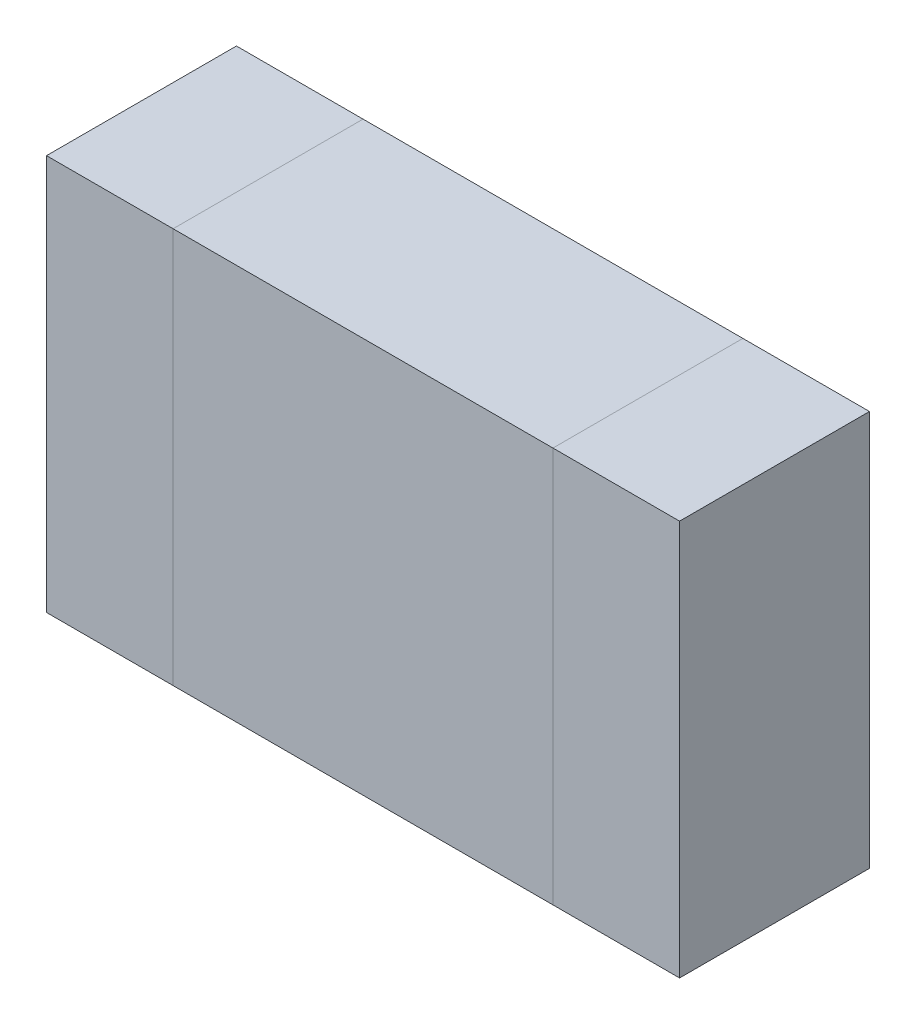
ISO-10303-21;
HEADER;
FILE_DESCRIPTION(('STEP AP214'),'2;1');
FILE_NAME('part.step','',(''),(''),'','','');
FILE_SCHEMA(('AUTOMOTIVE_DESIGN { 1 0 10303 214 1 1 1 1 }'));
ENDSEC;
DATA;
#1=APPLICATION_CONTEXT('core data for automotive mechanical design processes');
#2=APPLICATION_PROTOCOL_DEFINITION('international standard','automotive_design',2000,#1);
#3=PRODUCT_CONTEXT('',#1,'mechanical');
#4=PRODUCT('Part','Part','',(#3));
#5=PRODUCT_RELATED_PRODUCT_CATEGORY('part','',(#4));
#6=PRODUCT_DEFINITION_FORMATION('','',#4);
#7=PRODUCT_DEFINITION_CONTEXT('part definition',#1,'design');
#8=PRODUCT_DEFINITION('design','',#6,#7);
#9=PRODUCT_DEFINITION_SHAPE('','',#8);
#10=(LENGTH_UNIT() NAMED_UNIT(*) SI_UNIT(.MILLI.,.METRE.));
#11=(NAMED_UNIT(*) PLANE_ANGLE_UNIT() SI_UNIT($,.RADIAN.));
#12=(NAMED_UNIT(*) SI_UNIT($,.STERADIAN.) SOLID_ANGLE_UNIT());
#13=UNCERTAINTY_MEASURE_WITH_UNIT(LENGTH_MEASURE(1.E-05),#10,'distance_accuracy_value','');
#14=(GEOMETRIC_REPRESENTATION_CONTEXT(3) GLOBAL_UNCERTAINTY_ASSIGNED_CONTEXT((#13)) GLOBAL_UNIT_ASSIGNED_CONTEXT((#10,
#11,#12)) REPRESENTATION_CONTEXT('',''));
#15=CARTESIAN_POINT('',(0.,0.,0.));
#16=DIRECTION('',(0.,0.,1.));
#17=DIRECTION('',(1.,0.,0.));
#18=AXIS2_PLACEMENT_3D('',#15,#16,#17);
#19=CARTESIAN_POINT('',(1.,0.625,0.6));
#20=DIRECTION('',(0.,-1.,0.));
#21=DIRECTION('',(0.,0.,-1.));
#22=AXIS2_PLACEMENT_3D('',#19,#20,#21);
#23=PLANE('',#22);
#24=DIRECTION('',(0.,0.,1.));
#25=VECTOR('',#24,1.);
#26=CARTESIAN_POINT('',(-0.6,0.625,0.6));
#27=LINE('',#26,#25);
#28=CARTESIAN_POINT('',(-0.6,0.625,0.));
#29=VERTEX_POINT('',#28);
#30=CARTESIAN_POINT('',(-0.6,0.625,0.6));
#31=VERTEX_POINT('',#30);
#32=EDGE_CURVE('E11',#29,#31,#27,.T.);
#33=ORIENTED_EDGE('',*,*,#32,.F.);
#34=DIRECTION('',(-1.,0.,0.));
#35=VECTOR('',#34,1.);
#36=CARTESIAN_POINT('',(1.,0.625,0.));
#37=LINE('',#36,#35);
#38=CARTESIAN_POINT('',(-1.,0.625,0.));
#39=VERTEX_POINT('',#38);
#40=EDGE_CURVE('E23',#29,#39,#37,.T.);
#41=ORIENTED_EDGE('',*,*,#40,.T.);
#42=DIRECTION('',(0.,0.,-1.));
#43=VECTOR('',#42,1.);
#44=CARTESIAN_POINT('',(-1.,0.625,0.6));
#45=LINE('',#44,#43);
#46=CARTESIAN_POINT('',(-1.,0.625,0.6));
#47=VERTEX_POINT('',#46);
#48=EDGE_CURVE('E151',#47,#39,#45,.T.);
#49=ORIENTED_EDGE('',*,*,#48,.F.);
#50=DIRECTION('',(-1.,0.,0.));
#51=VECTOR('',#50,1.);
#52=CARTESIAN_POINT('',(1.,0.625,0.6));
#53=LINE('',#52,#51);
#54=EDGE_CURVE('E148',#31,#47,#53,.T.);
#55=ORIENTED_EDGE('',*,*,#54,.F.);
#56=EDGE_LOOP('',(#33,#41,#49,#55));
#57=FACE_BOUND('',#56,.T.);
#58=ADVANCED_FACE('F16',(#57),#23,.F.);
#59=CARTESIAN_POINT('',(1.,0.625,0.6));
#60=DIRECTION('',(0.,-1.,0.));
#61=DIRECTION('',(0.,0.,-1.));
#62=AXIS2_PLACEMENT_3D('',#59,#60,#61);
#63=PLANE('',#62);
#64=DIRECTION('',(0.,0.,-1.));
#65=VECTOR('',#64,1.);
#66=CARTESIAN_POINT('',(0.6,0.625,0.6));
#67=LINE('',#66,#65);
#68=CARTESIAN_POINT('',(0.6,0.625,0.6));
#69=VERTEX_POINT('',#68);
#70=CARTESIAN_POINT('',(0.6,0.625,0.));
#71=VERTEX_POINT('',#70);
#72=EDGE_CURVE('E146',#69,#71,#67,.T.);
#73=ORIENTED_EDGE('',*,*,#72,.F.);
#74=DIRECTION('',(-1.,0.,0.));
#75=VECTOR('',#74,1.);
#76=CARTESIAN_POINT('',(1.,0.625,0.6));
#77=LINE('',#76,#75);
#78=CARTESIAN_POINT('',(1.,0.625,0.6));
#79=VERTEX_POINT('',#78);
#80=EDGE_CURVE('E144',#79,#69,#77,.T.);
#81=ORIENTED_EDGE('',*,*,#80,.F.);
#82=DIRECTION('',(0.,0.,-1.));
#83=VECTOR('',#82,1.);
#84=CARTESIAN_POINT('',(1.,0.625,0.6));
#85=LINE('',#84,#83);
#86=CARTESIAN_POINT('',(1.,0.625,0.));
#87=VERTEX_POINT('',#86);
#88=EDGE_CURVE('E103',#79,#87,#85,.T.);
#89=ORIENTED_EDGE('',*,*,#88,.T.);
#90=DIRECTION('',(-1.,0.,0.));
#91=VECTOR('',#90,1.);
#92=CARTESIAN_POINT('',(1.,0.625,0.));
#93=LINE('',#92,#91);
#94=EDGE_CURVE('E140',#87,#71,#93,.T.);
#95=ORIENTED_EDGE('',*,*,#94,.T.);
#96=EDGE_LOOP('',(#73,#81,#89,#95));
#97=FACE_BOUND('',#96,.T.);
#98=ADVANCED_FACE('F182',(#97),#63,.F.);
#99=CARTESIAN_POINT('',(0.,0.,0.));
#100=DIRECTION('',(0.,0.,1.));
#101=DIRECTION('',(1.,0.,0.));
#102=AXIS2_PLACEMENT_3D('',#99,#100,#101);
#103=PLANE('',#102);
#104=DIRECTION('',(0.,1.,0.));
#105=VECTOR('',#104,1.);
#106=CARTESIAN_POINT('',(-0.6,0.,0.));
#107=LINE('',#106,#105);
#108=CARTESIAN_POINT('',(-0.6,-0.625,0.));
#109=VERTEX_POINT('',#108);
#110=EDGE_CURVE('E137',#109,#29,#107,.T.);
#111=ORIENTED_EDGE('',*,*,#110,.F.);
#112=DIRECTION('',(1.,0.,0.));
#113=VECTOR('',#112,1.);
#114=CARTESIAN_POINT('',(-1.,-0.625,0.));
#115=LINE('',#114,#113);
#116=CARTESIAN_POINT('',(-1.,-0.625,0.));
#117=VERTEX_POINT('',#116);
#118=EDGE_CURVE('E134',#117,#109,#115,.T.);
#119=ORIENTED_EDGE('',*,*,#118,.F.);
#120=DIRECTION('',(0.,-1.,0.));
#121=VECTOR('',#120,1.);
#122=CARTESIAN_POINT('',(-1.,0.625,0.));
#123=LINE('',#122,#121);
#124=EDGE_CURVE('E131',#39,#117,#123,.T.);
#125=ORIENTED_EDGE('',*,*,#124,.F.);
#126=ORIENTED_EDGE('',*,*,#40,.F.);
#127=EDGE_LOOP('',(#111,#119,#125,#126));
#128=FACE_BOUND('',#127,.T.);
#129=ADVANCED_FACE('F159',(#128),#103,.F.);
#130=CARTESIAN_POINT('',(0.,0.,0.));
#131=DIRECTION('',(0.,0.,1.));
#132=DIRECTION('',(1.,0.,0.));
#133=AXIS2_PLACEMENT_3D('',#130,#131,#132);
#134=PLANE('',#133);
#135=DIRECTION('',(0.,-1.,0.));
#136=VECTOR('',#135,1.);
#137=CARTESIAN_POINT('',(0.6,0.,0.));
#138=LINE('',#137,#136);
#139=CARTESIAN_POINT('',(0.6,-0.625,0.));
#140=VERTEX_POINT('',#139);
#141=EDGE_CURVE('E129',#71,#140,#138,.T.);
#142=ORIENTED_EDGE('',*,*,#141,.F.);
#143=ORIENTED_EDGE('',*,*,#94,.F.);
#144=DIRECTION('',(0.,1.,0.));
#145=VECTOR('',#144,1.);
#146=CARTESIAN_POINT('',(1.,-0.625,0.));
#147=LINE('',#146,#145);
#148=CARTESIAN_POINT('',(1.,-0.625,0.));
#149=VERTEX_POINT('',#148);
#150=EDGE_CURVE('E127',#149,#87,#147,.T.);
#151=ORIENTED_EDGE('',*,*,#150,.F.);
#152=DIRECTION('',(1.,0.,0.));
#153=VECTOR('',#152,1.);
#154=CARTESIAN_POINT('',(-1.,-0.625,0.));
#155=LINE('',#154,#153);
#156=EDGE_CURVE('E85',#140,#149,#155,.T.);
#157=ORIENTED_EDGE('',*,*,#156,.F.);
#158=EDGE_LOOP('',(#142,#143,#151,#157));
#159=FACE_BOUND('',#158,.T.);
#160=ADVANCED_FACE('F184',(#159),#134,.F.);
#161=CARTESIAN_POINT('',(-1.,-0.625,0.6));
#162=DIRECTION('',(0.,1.,0.));
#163=DIRECTION('',(0.,0.,1.));
#164=AXIS2_PLACEMENT_3D('',#161,#162,#163);
#165=PLANE('',#164);
#166=DIRECTION('',(0.,0.,-1.));
#167=VECTOR('',#166,1.);
#168=CARTESIAN_POINT('',(-0.6,-0.625,0.6));
#169=LINE('',#168,#167);
#170=CARTESIAN_POINT('',(-0.6,-0.625,0.6));
#171=VERTEX_POINT('',#170);
#172=EDGE_CURVE('E123',#171,#109,#169,.T.);
#173=ORIENTED_EDGE('',*,*,#172,.F.);
#174=DIRECTION('',(1.,0.,0.));
#175=VECTOR('',#174,1.);
#176=CARTESIAN_POINT('',(-1.,-0.625,0.6));
#177=LINE('',#176,#175);
#178=CARTESIAN_POINT('',(-1.,-0.625,0.6));
#179=VERTEX_POINT('',#178);
#180=EDGE_CURVE('E120',#179,#171,#177,.T.);
#181=ORIENTED_EDGE('',*,*,#180,.F.);
#182=DIRECTION('',(0.,0.,-1.));
#183=VECTOR('',#182,1.);
#184=CARTESIAN_POINT('',(-1.,-0.625,0.6));
#185=LINE('',#184,#183);
#186=EDGE_CURVE('E117',#179,#117,#185,.T.);
#187=ORIENTED_EDGE('',*,*,#186,.T.);
#188=ORIENTED_EDGE('',*,*,#118,.T.);
#189=EDGE_LOOP('',(#173,#181,#187,#188));
#190=FACE_BOUND('',#189,.T.);
#191=ADVANCED_FACE('F161',(#190),#165,.F.);
#192=CARTESIAN_POINT('',(-1.,-0.625,0.6));
#193=DIRECTION('',(0.,1.,0.));
#194=DIRECTION('',(0.,0.,1.));
#195=AXIS2_PLACEMENT_3D('',#192,#193,#194);
#196=PLANE('',#195);
#197=DIRECTION('',(0.,0.,1.));
#198=VECTOR('',#197,1.);
#199=CARTESIAN_POINT('',(0.6,-0.625,0.6));
#200=LINE('',#199,#198);
#201=CARTESIAN_POINT('',(0.6,-0.625,0.6));
#202=VERTEX_POINT('',#201);
#203=EDGE_CURVE('E89',#140,#202,#200,.T.);
#204=ORIENTED_EDGE('',*,*,#203,.F.);
#205=ORIENTED_EDGE('',*,*,#156,.T.);
#206=DIRECTION('',(0.,0.,-1.));
#207=VECTOR('',#206,1.);
#208=CARTESIAN_POINT('',(1.,-0.625,0.6));
#209=LINE('',#208,#207);
#210=CARTESIAN_POINT('',(1.,-0.625,0.6));
#211=VERTEX_POINT('',#210);
#212=EDGE_CURVE('E78',#211,#149,#209,.T.);
#213=ORIENTED_EDGE('',*,*,#212,.F.);
#214=DIRECTION('',(1.,0.,0.));
#215=VECTOR('',#214,1.);
#216=CARTESIAN_POINT('',(-1.,-0.625,0.6));
#217=LINE('',#216,#215);
#218=EDGE_CURVE('E82',#202,#211,#217,.T.);
#219=ORIENTED_EDGE('',*,*,#218,.F.);
#220=EDGE_LOOP('',(#204,#205,#213,#219));
#221=FACE_BOUND('',#220,.T.);
#222=ADVANCED_FACE('F81',(#221),#196,.F.);
#223=CARTESIAN_POINT('',(0.,0.,0.6));
#224=DIRECTION('',(0.,0.,1.));
#225=DIRECTION('',(1.,0.,0.));
#226=AXIS2_PLACEMENT_3D('',#223,#224,#225);
#227=PLANE('',#226);
#228=ORIENTED_EDGE('',*,*,#180,.T.);
#229=DIRECTION('',(0.,1.,0.));
#230=VECTOR('',#229,1.);
#231=CARTESIAN_POINT('',(-0.6,0.,0.6));
#232=LINE('',#231,#230);
#233=EDGE_CURVE('E99',#171,#31,#232,.T.);
#234=ORIENTED_EDGE('',*,*,#233,.T.);
#235=ORIENTED_EDGE('',*,*,#54,.T.);
#236=DIRECTION('',(0.,-1.,0.));
#237=VECTOR('',#236,1.);
#238=CARTESIAN_POINT('',(-1.,0.625,0.6));
#239=LINE('',#238,#237);
#240=EDGE_CURVE('E106',#47,#179,#239,.T.);
#241=ORIENTED_EDGE('',*,*,#240,.T.);
#242=EDGE_LOOP('',(#228,#234,#235,#241));
#243=FACE_BOUND('',#242,.T.);
#244=ADVANCED_FACE('F228',(#243),#227,.T.);
#245=CARTESIAN_POINT('',(0.,0.,0.6));
#246=DIRECTION('',(0.,0.,1.));
#247=DIRECTION('',(1.,0.,0.));
#248=AXIS2_PLACEMENT_3D('',#245,#246,#247);
#249=PLANE('',#248);
#250=ORIENTED_EDGE('',*,*,#80,.T.);
#251=DIRECTION('',(0.,-1.,0.));
#252=VECTOR('',#251,1.);
#253=CARTESIAN_POINT('',(0.6,0.,0.6));
#254=LINE('',#253,#252);
#255=EDGE_CURVE('E97',#69,#202,#254,.T.);
#256=ORIENTED_EDGE('',*,*,#255,.T.);
#257=ORIENTED_EDGE('',*,*,#218,.T.);
#258=DIRECTION('',(0.,1.,0.));
#259=VECTOR('',#258,1.);
#260=CARTESIAN_POINT('',(1.,-0.625,0.6));
#261=LINE('',#260,#259);
#262=EDGE_CURVE('E95',#211,#79,#261,.T.);
#263=ORIENTED_EDGE('',*,*,#262,.T.);
#264=EDGE_LOOP('',(#250,#256,#257,#263));
#265=FACE_BOUND('',#264,.T.);
#266=ADVANCED_FACE('F94',(#265),#249,.T.);
#267=CARTESIAN_POINT('',(-1.,0.625,0.6));
#268=DIRECTION('',(1.,0.,0.));
#269=DIRECTION('',(0.,0.,-1.));
#270=AXIS2_PLACEMENT_3D('',#267,#268,#269);
#271=PLANE('',#270);
#272=ORIENTED_EDGE('',*,*,#124,.T.);
#273=ORIENTED_EDGE('',*,*,#186,.F.);
#274=ORIENTED_EDGE('',*,*,#240,.F.);
#275=ORIENTED_EDGE('',*,*,#48,.T.);
#276=EDGE_LOOP('',(#272,#273,#274,#275));
#277=FACE_BOUND('',#276,.T.);
#278=ADVANCED_FACE('F157',(#277),#271,.F.);
#279=CARTESIAN_POINT('',(-1.,-0.625,0.6));
#280=DIRECTION('',(0.,1.,0.));
#281=DIRECTION('',(0.,0.,1.));
#282=AXIS2_PLACEMENT_3D('',#279,#280,#281);
#283=PLANE('',#282);
#284=DIRECTION('',(1.,0.,0.));
#285=VECTOR('',#284,1.);
#286=CARTESIAN_POINT('',(-1.,-0.625,0.6));
#287=LINE('',#286,#285);
#288=EDGE_CURVE('E104',#171,#202,#287,.T.);
#289=ORIENTED_EDGE('',*,*,#288,.F.);
#290=ORIENTED_EDGE('',*,*,#172,.T.);
#291=DIRECTION('',(1.,0.,0.));
#292=VECTOR('',#291,1.);
#293=CARTESIAN_POINT('',(-1.,-0.625,0.));
#294=LINE('',#293,#292);
#295=EDGE_CURVE('E108',#109,#140,#294,.T.);
#296=ORIENTED_EDGE('',*,*,#295,.T.);
#297=ORIENTED_EDGE('',*,*,#203,.T.);
#298=EDGE_LOOP('',(#289,#290,#296,#297));
#299=FACE_BOUND('',#298,.T.);
#300=ADVANCED_FACE('F166',(#299),#283,.F.);
#301=CARTESIAN_POINT('',(1.,-0.625,0.6));
#302=DIRECTION('',(-1.,0.,0.));
#303=DIRECTION('',(0.,0.,1.));
#304=AXIS2_PLACEMENT_3D('',#301,#302,#303);
#305=PLANE('',#304);
#306=ORIENTED_EDGE('',*,*,#150,.T.);
#307=ORIENTED_EDGE('',*,*,#88,.F.);
#308=ORIENTED_EDGE('',*,*,#262,.F.);
#309=ORIENTED_EDGE('',*,*,#212,.T.);
#310=EDGE_LOOP('',(#306,#307,#308,#309));
#311=FACE_BOUND('',#310,.T.);
#312=ADVANCED_FACE('F102',(#311),#305,.F.);
#313=CARTESIAN_POINT('',(1.,0.625,0.6));
#314=DIRECTION('',(0.,-1.,0.));
#315=DIRECTION('',(0.,0.,-1.));
#316=AXIS2_PLACEMENT_3D('',#313,#314,#315);
#317=PLANE('',#316);
#318=DIRECTION('',(-1.,0.,0.));
#319=VECTOR('',#318,1.);
#320=CARTESIAN_POINT('',(1.,0.625,0.));
#321=LINE('',#320,#319);
#322=EDGE_CURVE('E171',#71,#29,#321,.T.);
#323=ORIENTED_EDGE('',*,*,#322,.T.);
#324=ORIENTED_EDGE('',*,*,#32,.T.);
#325=DIRECTION('',(-1.,0.,0.));
#326=VECTOR('',#325,1.);
#327=CARTESIAN_POINT('',(1.,0.625,0.6));
#328=LINE('',#327,#326);
#329=EDGE_CURVE('E172',#69,#31,#328,.T.);
#330=ORIENTED_EDGE('',*,*,#329,.F.);
#331=ORIENTED_EDGE('',*,*,#72,.T.);
#332=EDGE_LOOP('',(#323,#324,#330,#331));
#333=FACE_BOUND('',#332,.T.);
#334=ADVANCED_FACE('F179',(#333),#317,.F.);
#335=CARTESIAN_POINT('',(0.,0.,0.6));
#336=DIRECTION('',(0.,0.,1.));
#337=DIRECTION('',(1.,0.,0.));
#338=AXIS2_PLACEMENT_3D('',#335,#336,#337);
#339=PLANE('',#338);
#340=ORIENTED_EDGE('',*,*,#233,.F.);
#341=ORIENTED_EDGE('',*,*,#288,.T.);
#342=ORIENTED_EDGE('',*,*,#255,.F.);
#343=ORIENTED_EDGE('',*,*,#329,.T.);
#344=EDGE_LOOP('',(#340,#341,#342,#343));
#345=FACE_BOUND('',#344,.T.);
#346=ADVANCED_FACE('F178',(#345),#339,.T.);
#347=CARTESIAN_POINT('',(0.,0.,0.));
#348=DIRECTION('',(0.,0.,1.));
#349=DIRECTION('',(1.,0.,0.));
#350=AXIS2_PLACEMENT_3D('',#347,#348,#349);
#351=PLANE('',#350);
#352=ORIENTED_EDGE('',*,*,#295,.F.);
#353=ORIENTED_EDGE('',*,*,#110,.T.);
#354=ORIENTED_EDGE('',*,*,#322,.F.);
#355=ORIENTED_EDGE('',*,*,#141,.T.);
#356=EDGE_LOOP('',(#352,#353,#354,#355));
#357=FACE_BOUND('',#356,.T.);
#358=ADVANCED_FACE('F168',(#357),#351,.F.);
#359=CLOSED_SHELL('',(#58,#98,#129,#160,#191,#222,#244,#266,#278,#300,#312,#334,#346,#358));
#360=MANIFOLD_SOLID_BREP('B1',#359);
#361=ADVANCED_BREP_SHAPE_REPRESENTATION('',(#18,#360),#14);
#362=SHAPE_DEFINITION_REPRESENTATION(#9,#361);
ENDSEC;
END-ISO-10303-21;
